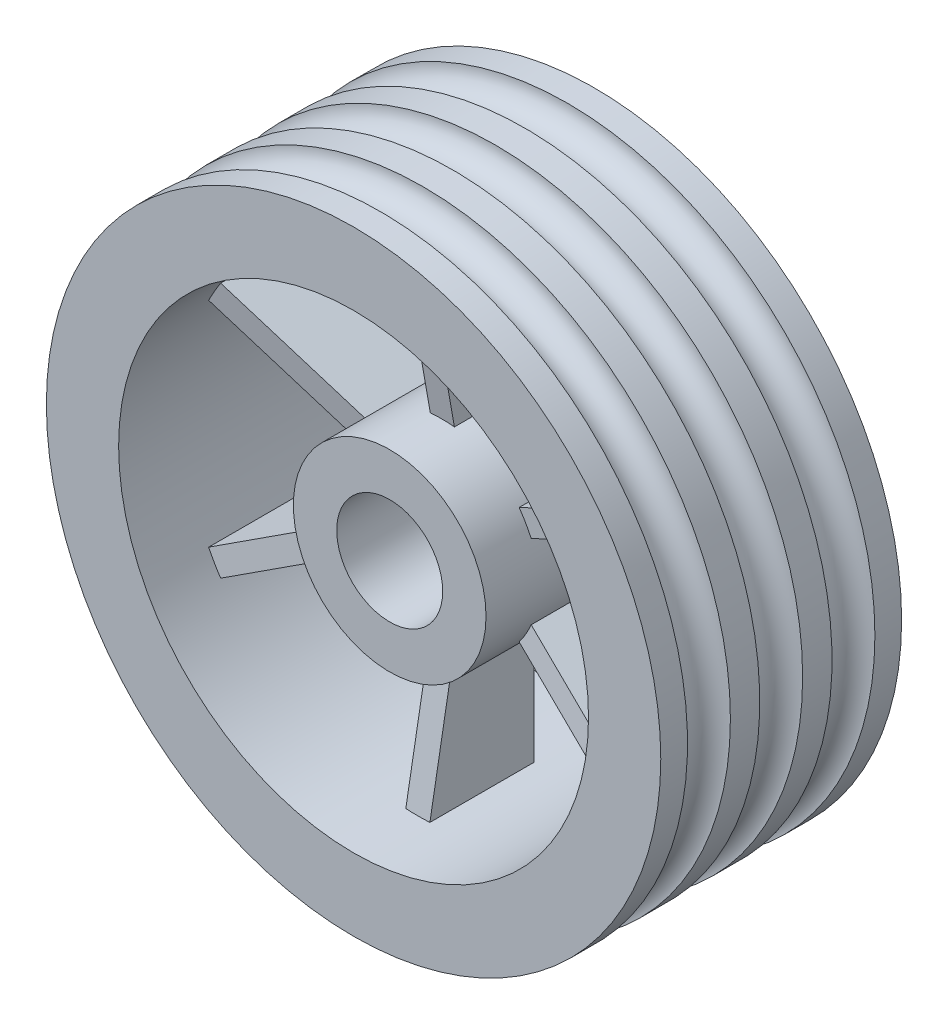
ISO-10303-21;
HEADER;
FILE_DESCRIPTION(('STEP AP214'),'2;1');
FILE_NAME('part.step','',(''),(''),'','','');
FILE_SCHEMA(('AUTOMOTIVE_DESIGN { 1 0 10303 214 1 1 1 1 }'));
ENDSEC;
DATA;
#1=APPLICATION_CONTEXT('core data for automotive mechanical design processes');
#2=APPLICATION_PROTOCOL_DEFINITION('international standard','automotive_design',2000,#1);
#3=PRODUCT_CONTEXT('',#1,'mechanical');
#4=PRODUCT('Part','Part','',(#3));
#5=PRODUCT_RELATED_PRODUCT_CATEGORY('part','',(#4));
#6=PRODUCT_DEFINITION_FORMATION('','',#4);
#7=PRODUCT_DEFINITION_CONTEXT('part definition',#1,'design');
#8=PRODUCT_DEFINITION('design','',#6,#7);
#9=PRODUCT_DEFINITION_SHAPE('','',#8);
#10=(LENGTH_UNIT() NAMED_UNIT(*) SI_UNIT(.MILLI.,.METRE.));
#11=(NAMED_UNIT(*) PLANE_ANGLE_UNIT() SI_UNIT($,.RADIAN.));
#12=(NAMED_UNIT(*) SI_UNIT($,.STERADIAN.) SOLID_ANGLE_UNIT());
#13=UNCERTAINTY_MEASURE_WITH_UNIT(LENGTH_MEASURE(1.E-05),#10,'distance_accuracy_value','');
#14=(GEOMETRIC_REPRESENTATION_CONTEXT(3) GLOBAL_UNCERTAINTY_ASSIGNED_CONTEXT((#13)) GLOBAL_UNIT_ASSIGNED_CONTEXT((#10,
#11,#12)) REPRESENTATION_CONTEXT('',''));
#15=CARTESIAN_POINT('',(0.,0.,0.));
#16=DIRECTION('',(0.,0.,1.));
#17=DIRECTION('',(1.,0.,0.));
#18=AXIS2_PLACEMENT_3D('',#15,#16,#17);
#19=CARTESIAN_POINT('',(0.,0.,10.));
#20=DIRECTION('',(0.,0.,-1.));
#21=DIRECTION('',(-1.,0.,0.));
#22=AXIS2_PLACEMENT_3D('',#19,#20,#21);
#23=CYLINDRICAL_SURFACE('',#22,12.755);
#24=CARTESIAN_POINT('',(0.,0.,1.11));
#25=DIRECTION('',(0.,0.,1.));
#26=DIRECTION('',(1.,0.,0.));
#27=AXIS2_PLACEMENT_3D('',#24,#25,#26);
#28=CIRCLE('',#27,12.755);
#29=CARTESIAN_POINT('',(12.755,0.,1.11));
#30=VERTEX_POINT('',#29);
#31=EDGE_CURVE('E436',#30,#30,#28,.F.);
#32=ORIENTED_EDGE('',*,*,#31,.T.);
#33=EDGE_LOOP('',(#32));
#34=FACE_BOUND('',#33,.T.);
#35=CARTESIAN_POINT('',(0.,0.,0.));
#36=DIRECTION('',(0.,0.,1.));
#37=DIRECTION('',(1.,0.,0.));
#38=AXIS2_PLACEMENT_3D('',#35,#36,#37);
#39=CIRCLE('',#38,12.755);
#40=CARTESIAN_POINT('',(12.755,0.,0.));
#41=VERTEX_POINT('',#40);
#42=EDGE_CURVE('E386',#41,#41,#39,.T.);
#43=ORIENTED_EDGE('',*,*,#42,.T.);
#44=EDGE_LOOP('',(#43));
#45=FACE_BOUND('',#44,.T.);
#46=ADVANCED_FACE('F41',(#34,#45),#23,.T.);
#47=CARTESIAN_POINT('',(0.,0.,10.));
#48=DIRECTION('',(0.,0.,-1.));
#49=DIRECTION('',(-1.,0.,0.));
#50=AXIS2_PLACEMENT_3D('',#47,#48,#49);
#51=CYLINDRICAL_SURFACE('',#50,9.755);
#52=CARTESIAN_POINT('',(0.,0.,10.));
#53=DIRECTION('',(0.,0.,1.));
#54=DIRECTION('',(1.,0.,0.));
#55=AXIS2_PLACEMENT_3D('',#52,#53,#54);
#56=CIRCLE('',#55,9.755);
#57=CARTESIAN_POINT('',(9.755,0.,10.));
#58=VERTEX_POINT('',#57);
#59=EDGE_CURVE('E383',#58,#58,#56,.T.);
#60=ORIENTED_EDGE('',*,*,#59,.T.);
#61=EDGE_LOOP('',(#60));
#62=FACE_BOUND('',#61,.T.);
#63=CARTESIAN_POINT('',(0.,0.,0.));
#64=DIRECTION('',(0.,0.,1.));
#65=DIRECTION('',(1.,0.,0.));
#66=AXIS2_PLACEMENT_3D('',#63,#64,#65);
#67=CIRCLE('',#66,9.755);
#68=CARTESIAN_POINT('',(9.755,0.,0.));
#69=VERTEX_POINT('',#68);
#70=EDGE_CURVE('E382',#69,#69,#67,.T.);
#71=ORIENTED_EDGE('',*,*,#70,.F.);
#72=EDGE_LOOP('',(#71));
#73=FACE_BOUND('',#72,.T.);
#74=CARTESIAN_POINT('',(0.,0.,3.));
#75=DIRECTION('',(0.,0.,-1.));
#76=DIRECTION('',(-1.,0.,0.));
#77=AXIS2_PLACEMENT_3D('',#74,#75,#76);
#78=CIRCLE('',#77,9.755);
#79=CARTESIAN_POINT('',(-0.5,9.74217763131016,3.));
#80=VERTEX_POINT('',#79);
#81=CARTESIAN_POINT('',(0.5,9.74217763131016,3.));
#82=VERTEX_POINT('',#81);
#83=EDGE_CURVE('E397',#80,#82,#78,.T.);
#84=ORIENTED_EDGE('',*,*,#83,.F.);
#85=DIRECTION('',(0.,0.,-1.));
#86=VECTOR('',#85,1.);
#87=CARTESIAN_POINT('',(-0.5,9.74217763131016,10.));
#88=LINE('',#87,#86);
#89=CARTESIAN_POINT('',(-0.5,9.74217763131016,7.33097252317238));
#90=VERTEX_POINT('',#89);
#91=EDGE_CURVE('E403',#80,#90,#88,.F.);
#92=ORIENTED_EDGE('',*,*,#91,.T.);
#93=CARTESIAN_POINT('',(0.,0.,5.61176470588235));
#94=DIRECTION('',(0.,-0.173785333909048,0.984783558817937));
#95=DIRECTION('',(0.,-0.984783558817937,-0.173785333909048));
#96=AXIS2_PLACEMENT_3D('',#93,#94,#95);
#97=ELLIPSE('',#96,9.90572995726005,9.755);
#98=CARTESIAN_POINT('',(0.5,9.74217763131016,7.33097252317238));
#99=VERTEX_POINT('',#98);
#100=EDGE_CURVE('E400',#99,#90,#97,.T.);
#101=ORIENTED_EDGE('',*,*,#100,.F.);
#102=DIRECTION('',(0.,0.,-1.));
#103=VECTOR('',#102,1.);
#104=CARTESIAN_POINT('',(0.5,9.74217763131016,10.));
#105=LINE('',#104,#103);
#106=EDGE_CURVE('E392',#82,#99,#105,.F.);
#107=ORIENTED_EDGE('',*,*,#106,.F.);
#108=EDGE_LOOP('',(#84,#92,#101,#107));
#109=FACE_BOUND('',#108,.T.);
#110=CARTESIAN_POINT('',(0.,0.,3.));
#111=DIRECTION('',(0.,0.,-1.));
#112=DIRECTION('',(-1.,0.,0.));
#113=AXIS2_PLACEMENT_3D('',#110,#111,#112);
#114=CIRCLE('',#113,9.755);
#115=CARTESIAN_POINT('',(8.18697331689512,5.30410151754728,3.));
#116=VERTEX_POINT('',#115);
#117=CARTESIAN_POINT('',(8.68697331689512,4.43807611376284,3.));
#118=VERTEX_POINT('',#117);
#119=EDGE_CURVE('E339',#116,#118,#114,.T.);
#120=ORIENTED_EDGE('',*,*,#119,.F.);
#121=DIRECTION('',(0.,0.,-1.));
#122=VECTOR('',#121,1.);
#123=CARTESIAN_POINT('',(8.18697331689512,5.30410151754728,10.));
#124=LINE('',#123,#122);
#125=CARTESIAN_POINT('',(8.18697331689513,5.30410151754728,7.33097252317238));
#126=VERTEX_POINT('',#125);
#127=EDGE_CURVE('E351',#116,#126,#124,.F.);
#128=ORIENTED_EDGE('',*,*,#127,.T.);
#129=CARTESIAN_POINT('',(0.,0.,5.61176470588235));
#130=DIRECTION('',(-0.150502513970397,-0.0868926669545235,0.984783558817937));
#131=DIRECTION('',(-0.852847579165581,-0.492391779408967,-0.173785333909048));
#132=AXIS2_PLACEMENT_3D('',#129,#130,#131);
#133=ELLIPSE('',#132,9.90572995726005,9.755);
#134=CARTESIAN_POINT('',(8.68697331689512,4.43807611376284,7.33097252317238));
#135=VERTEX_POINT('',#134);
#136=EDGE_CURVE('E345',#135,#126,#133,.T.);
#137=ORIENTED_EDGE('',*,*,#136,.F.);
#138=DIRECTION('',(0.,0.,-1.));
#139=VECTOR('',#138,1.);
#140=CARTESIAN_POINT('',(8.68697331689512,4.43807611376284,10.));
#141=LINE('',#140,#139);
#142=EDGE_CURVE('E348',#118,#135,#141,.F.);
#143=ORIENTED_EDGE('',*,*,#142,.F.);
#144=EDGE_LOOP('',(#120,#128,#137,#143));
#145=FACE_BOUND('',#144,.T.);
#146=CARTESIAN_POINT('',(0.,0.,3.));
#147=DIRECTION('',(0.,0.,-1.));
#148=DIRECTION('',(-1.,0.,0.));
#149=AXIS2_PLACEMENT_3D('',#146,#147,#148);
#150=CIRCLE('',#149,9.755);
#151=CARTESIAN_POINT('',(8.68697331689509,-4.4380761137629,3.));
#152=VERTEX_POINT('',#151);
#153=CARTESIAN_POINT('',(8.18697331689508,-5.30410151754734,3.));
#154=VERTEX_POINT('',#153);
#155=EDGE_CURVE('E310',#152,#154,#150,.T.);
#156=ORIENTED_EDGE('',*,*,#155,.F.);
#157=DIRECTION('',(0.,0.,-1.));
#158=VECTOR('',#157,1.);
#159=CARTESIAN_POINT('',(8.68697331689509,-4.4380761137629,10.));
#160=LINE('',#159,#158);
#161=CARTESIAN_POINT('',(8.68697331689509,-4.4380761137629,7.33097252317238));
#162=VERTEX_POINT('',#161);
#163=EDGE_CURVE('E322',#152,#162,#160,.F.);
#164=ORIENTED_EDGE('',*,*,#163,.T.);
#165=CARTESIAN_POINT('',(0.,0.,5.61176470588235));
#166=DIRECTION('',(-0.150502513970396,0.0868926669545245,0.984783558817937));
#167=DIRECTION('',(-0.852847579165578,0.492391779408972,-0.173785333909048));
#168=AXIS2_PLACEMENT_3D('',#165,#166,#167);
#169=ELLIPSE('',#168,9.90572995726005,9.755);
#170=CARTESIAN_POINT('',(8.18697331689508,-5.30410151754734,7.33097252317238));
#171=VERTEX_POINT('',#170);
#172=EDGE_CURVE('E316',#171,#162,#169,.T.);
#173=ORIENTED_EDGE('',*,*,#172,.F.);
#174=DIRECTION('',(0.,0.,-1.));
#175=VECTOR('',#174,1.);
#176=CARTESIAN_POINT('',(8.18697331689508,-5.30410151754734,10.));
#177=LINE('',#176,#175);
#178=EDGE_CURVE('E319',#154,#171,#177,.F.);
#179=ORIENTED_EDGE('',*,*,#178,.F.);
#180=EDGE_LOOP('',(#156,#164,#173,#179));
#181=FACE_BOUND('',#180,.T.);
#182=CARTESIAN_POINT('',(0.,0.,3.));
#183=DIRECTION('',(0.,0.,-1.));
#184=DIRECTION('',(-1.,0.,0.));
#185=AXIS2_PLACEMENT_3D('',#182,#183,#184);
#186=CIRCLE('',#185,9.755);
#187=CARTESIAN_POINT('',(0.5,-9.74217763131016,3.));
#188=VERTEX_POINT('',#187);
#189=CARTESIAN_POINT('',(-0.5,-9.74217763131016,3.));
#190=VERTEX_POINT('',#189);
#191=EDGE_CURVE('E281',#188,#190,#186,.T.);
#192=ORIENTED_EDGE('',*,*,#191,.F.);
#193=DIRECTION('',(0.,0.,-1.));
#194=VECTOR('',#193,1.);
#195=CARTESIAN_POINT('',(0.5,-9.74217763131016,10.));
#196=LINE('',#195,#194);
#197=CARTESIAN_POINT('',(0.5,-9.74217763131016,7.33097252317238));
#198=VERTEX_POINT('',#197);
#199=EDGE_CURVE('E293',#188,#198,#196,.F.);
#200=ORIENTED_EDGE('',*,*,#199,.T.);
#201=CARTESIAN_POINT('',(0.,0.,5.61176470588235));
#202=DIRECTION('',(0.,0.173785333909048,0.984783558817937));
#203=DIRECTION('',(0.,0.984783558817937,-0.173785333909048));
#204=AXIS2_PLACEMENT_3D('',#201,#202,#203);
#205=ELLIPSE('',#204,9.90572995726005,9.755);
#206=CARTESIAN_POINT('',(-0.5,-9.74217763131016,7.33097252317238));
#207=VERTEX_POINT('',#206);
#208=EDGE_CURVE('E287',#207,#198,#205,.T.);
#209=ORIENTED_EDGE('',*,*,#208,.F.);
#210=DIRECTION('',(0.,0.,-1.));
#211=VECTOR('',#210,1.);
#212=CARTESIAN_POINT('',(-0.5,-9.74217763131016,10.));
#213=LINE('',#212,#211);
#214=EDGE_CURVE('E290',#190,#207,#213,.F.);
#215=ORIENTED_EDGE('',*,*,#214,.F.);
#216=EDGE_LOOP('',(#192,#200,#209,#215));
#217=FACE_BOUND('',#216,.T.);
#218=CARTESIAN_POINT('',(0.,0.,3.));
#219=DIRECTION('',(0.,0.,-1.));
#220=DIRECTION('',(-1.,0.,0.));
#221=AXIS2_PLACEMENT_3D('',#218,#219,#220);
#222=CIRCLE('',#221,9.755);
#223=CARTESIAN_POINT('',(-8.18697331689516,-5.30410151754722,3.));
#224=VERTEX_POINT('',#223);
#225=CARTESIAN_POINT('',(-8.68697331689515,-4.43807611376278,3.));
#226=VERTEX_POINT('',#225);
#227=EDGE_CURVE('E252',#224,#226,#222,.T.);
#228=ORIENTED_EDGE('',*,*,#227,.F.);
#229=DIRECTION('',(0.,0.,-1.));
#230=VECTOR('',#229,1.);
#231=CARTESIAN_POINT('',(-8.18697331689516,-5.30410151754722,10.));
#232=LINE('',#231,#230);
#233=CARTESIAN_POINT('',(-8.18697331689516,-5.30410151754723,7.33097252317238));
#234=VERTEX_POINT('',#233);
#235=EDGE_CURVE('E264',#224,#234,#232,.F.);
#236=ORIENTED_EDGE('',*,*,#235,.T.);
#237=CARTESIAN_POINT('',(0.,0.,5.61176470588235));
#238=DIRECTION('',(0.150502513970397,0.0868926669545224,0.984783558817937));
#239=DIRECTION('',(0.852847579165585,0.492391779408961,-0.173785333909048));
#240=AXIS2_PLACEMENT_3D('',#237,#238,#239);
#241=ELLIPSE('',#240,9.90572995726005,9.755);
#242=CARTESIAN_POINT('',(-8.68697331689515,-4.43807611376278,7.33097252317238));
#243=VERTEX_POINT('',#242);
#244=EDGE_CURVE('E258',#243,#234,#241,.T.);
#245=ORIENTED_EDGE('',*,*,#244,.F.);
#246=DIRECTION('',(0.,0.,-1.));
#247=VECTOR('',#246,1.);
#248=CARTESIAN_POINT('',(-8.68697331689515,-4.43807611376278,10.));
#249=LINE('',#248,#247);
#250=EDGE_CURVE('E261',#226,#243,#249,.F.);
#251=ORIENTED_EDGE('',*,*,#250,.F.);
#252=EDGE_LOOP('',(#228,#236,#245,#251));
#253=FACE_BOUND('',#252,.T.);
#254=CARTESIAN_POINT('',(0.,0.,3.));
#255=DIRECTION('',(0.,0.,-1.));
#256=DIRECTION('',(-1.,0.,0.));
#257=AXIS2_PLACEMENT_3D('',#254,#255,#256);
#258=CIRCLE('',#257,9.755);
#259=CARTESIAN_POINT('',(-8.68697331689506,4.43807611376296,3.));
#260=VERTEX_POINT('',#259);
#261=CARTESIAN_POINT('',(-8.18697331689505,5.30410151754739,3.));
#262=VERTEX_POINT('',#261);
#263=EDGE_CURVE('E63',#260,#262,#258,.T.);
#264=ORIENTED_EDGE('',*,*,#263,.F.);
#265=DIRECTION('',(0.,0.,-1.));
#266=VECTOR('',#265,1.);
#267=CARTESIAN_POINT('',(-8.68697331689506,4.43807611376296,10.));
#268=LINE('',#267,#266);
#269=CARTESIAN_POINT('',(-8.68697331689506,4.43807611376296,7.33097252317238));
#270=VERTEX_POINT('',#269);
#271=EDGE_CURVE('E58',#260,#270,#268,.F.);
#272=ORIENTED_EDGE('',*,*,#271,.T.);
#273=CARTESIAN_POINT('',(0.,0.,5.61176470588235));
#274=DIRECTION('',(0.150502513970395,-0.0868926669545256,0.984783558817937));
#275=DIRECTION('',(0.852847579165575,-0.492391779408978,-0.173785333909048));
#276=AXIS2_PLACEMENT_3D('',#273,#274,#275);
#277=ELLIPSE('',#276,9.90572995726005,9.755);
#278=CARTESIAN_POINT('',(-8.18697331689505,5.30410151754739,7.33097252317238));
#279=VERTEX_POINT('',#278);
#280=EDGE_CURVE('E232',#279,#270,#277,.T.);
#281=ORIENTED_EDGE('',*,*,#280,.F.);
#282=DIRECTION('',(0.,0.,-1.));
#283=VECTOR('',#282,1.);
#284=CARTESIAN_POINT('',(-8.18697331689505,5.30410151754739,10.));
#285=LINE('',#284,#283);
#286=EDGE_CURVE('E234',#262,#279,#285,.F.);
#287=ORIENTED_EDGE('',*,*,#286,.F.);
#288=EDGE_LOOP('',(#264,#272,#281,#287));
#289=FACE_BOUND('',#288,.T.);
#290=ADVANCED_FACE('F462',(#62,#73,#109,#145,#181,#217,#253,#289),#51,.F.);
#291=CARTESIAN_POINT('',(0.,0.,-0.5));
#292=DIRECTION('',(0.,0.,1.));
#293=DIRECTION('',(1.,0.,0.));
#294=AXIS2_PLACEMENT_3D('',#291,#292,#293);
#295=CYLINDRICAL_SURFACE('',#294,4.);
#296=CARTESIAN_POINT('',(0.,0.,8.5));
#297=DIRECTION('',(0.,0.,1.));
#298=DIRECTION('',(1.,0.,0.));
#299=AXIS2_PLACEMENT_3D('',#296,#297,#298);
#300=CIRCLE('',#299,4.);
#301=CARTESIAN_POINT('',(4.,0.,8.5));
#302=VERTEX_POINT('',#301);
#303=EDGE_CURVE('E356',#302,#302,#300,.T.);
#304=ORIENTED_EDGE('',*,*,#303,.F.);
#305=EDGE_LOOP('',(#304));
#306=FACE_BOUND('',#305,.T.);
#307=CARTESIAN_POINT('',(0.,0.,-0.5));
#308=DIRECTION('',(0.,0.,1.));
#309=DIRECTION('',(1.,0.,0.));
#310=AXIS2_PLACEMENT_3D('',#307,#308,#309);
#311=CIRCLE('',#310,4.);
#312=CARTESIAN_POINT('',(4.,0.,-0.5));
#313=VERTEX_POINT('',#312);
#314=EDGE_CURVE('E362',#313,#313,#311,.T.);
#315=ORIENTED_EDGE('',*,*,#314,.T.);
#316=EDGE_LOOP('',(#315));
#317=FACE_BOUND('',#316,.T.);
#318=DIRECTION('',(0.,0.,1.));
#319=VECTOR('',#318,1.);
#320=CARTESIAN_POINT('',(-0.5,3.96862696659689,-0.5));
#321=LINE('',#320,#319);
#322=CARTESIAN_POINT('',(-0.5,3.96862696659689,3.));
#323=VERTEX_POINT('',#322);
#324=CARTESIAN_POINT('',(-0.5,3.96862696659689,6.31211064116416));
#325=VERTEX_POINT('',#324);
#326=EDGE_CURVE('E371',#323,#325,#321,.T.);
#327=ORIENTED_EDGE('',*,*,#326,.F.);
#328=CARTESIAN_POINT('',(0.,0.,3.));
#329=DIRECTION('',(0.,0.,-1.));
#330=DIRECTION('',(-1.,0.,0.));
#331=AXIS2_PLACEMENT_3D('',#328,#329,#330);
#332=CIRCLE('',#331,4.);
#333=CARTESIAN_POINT('',(0.5,3.96862696659689,3.));
#334=VERTEX_POINT('',#333);
#335=EDGE_CURVE('E365',#323,#334,#332,.T.);
#336=ORIENTED_EDGE('',*,*,#335,.T.);
#337=DIRECTION('',(0.,0.,1.));
#338=VECTOR('',#337,1.);
#339=CARTESIAN_POINT('',(0.5,3.96862696659689,-0.5));
#340=LINE('',#339,#338);
#341=CARTESIAN_POINT('',(0.5,3.96862696659689,6.31211064116416));
#342=VERTEX_POINT('',#341);
#343=EDGE_CURVE('E405',#334,#342,#340,.T.);
#344=ORIENTED_EDGE('',*,*,#343,.T.);
#345=CARTESIAN_POINT('',(0.,0.,5.61176470588235));
#346=DIRECTION('',(0.,-0.173785333909048,0.984783558817937));
#347=DIRECTION('',(0.,0.984783558817937,0.173785333909048));
#348=AXIS2_PLACEMENT_3D('',#345,#346,#347);
#349=ELLIPSE('',#348,4.06180623567813,4.);
#350=EDGE_CURVE('E368',#342,#325,#349,.T.);
#351=ORIENTED_EDGE('',*,*,#350,.T.);
#352=EDGE_LOOP('',(#327,#336,#344,#351));
#353=FACE_BOUND('',#352,.T.);
#354=CARTESIAN_POINT('',(0.,0.,5.61176470588235));
#355=DIRECTION('',(-0.150502513970397,-0.0868926669545235,0.984783558817937));
#356=DIRECTION('',(0.852847579165581,0.492391779408967,0.173785333909048));
#357=AXIS2_PLACEMENT_3D('',#354,#355,#356);
#358=ELLIPSE('',#357,4.06180623567813,4.);
#359=CARTESIAN_POINT('',(3.18693177121689,2.41732618519066,6.31211064116416));
#360=VERTEX_POINT('',#359);
#361=CARTESIAN_POINT('',(3.68693177121688,1.55130078140622,6.31211064116416));
#362=VERTEX_POINT('',#361);
#363=EDGE_CURVE('E342',#360,#362,#358,.F.);
#364=ORIENTED_EDGE('',*,*,#363,.F.);
#365=DIRECTION('',(0.,0.,1.));
#366=VECTOR('',#365,1.);
#367=CARTESIAN_POINT('',(3.18693177121689,2.41732618519065,-0.5));
#368=LINE('',#367,#366);
#369=CARTESIAN_POINT('',(3.18693177121689,2.41732618519066,3.));
#370=VERTEX_POINT('',#369);
#371=EDGE_CURVE('E411',#360,#370,#368,.F.);
#372=ORIENTED_EDGE('',*,*,#371,.T.);
#373=CARTESIAN_POINT('',(0.,0.,3.));
#374=DIRECTION('',(0.,0.,-1.));
#375=DIRECTION('',(-1.,0.,0.));
#376=AXIS2_PLACEMENT_3D('',#373,#374,#375);
#377=CIRCLE('',#376,4.);
#378=CARTESIAN_POINT('',(3.68693177121688,1.55130078140621,3.));
#379=VERTEX_POINT('',#378);
#380=EDGE_CURVE('E336',#379,#370,#377,.F.);
#381=ORIENTED_EDGE('',*,*,#380,.F.);
#382=DIRECTION('',(0.,0.,1.));
#383=VECTOR('',#382,1.);
#384=CARTESIAN_POINT('',(3.68693177121688,1.55130078140621,-0.5));
#385=LINE('',#384,#383);
#386=EDGE_CURVE('E408',#362,#379,#385,.F.);
#387=ORIENTED_EDGE('',*,*,#386,.F.);
#388=EDGE_LOOP('',(#364,#372,#381,#387));
#389=FACE_BOUND('',#388,.T.);
#390=CARTESIAN_POINT('',(0.,0.,5.61176470588235));
#391=DIRECTION('',(-0.150502513970396,0.0868926669545245,0.984783558817937));
#392=DIRECTION('',(0.852847579165578,-0.492391779408972,0.173785333909048));
#393=AXIS2_PLACEMENT_3D('',#390,#391,#392);
#394=ELLIPSE('',#393,4.06180623567813,4.);
#395=CARTESIAN_POINT('',(3.68693177121687,-1.55130078140624,6.31211064116416));
#396=VERTEX_POINT('',#395);
#397=CARTESIAN_POINT('',(3.18693177121687,-2.41732618519068,6.31211064116416));
#398=VERTEX_POINT('',#397);
#399=EDGE_CURVE('E313',#396,#398,#394,.F.);
#400=ORIENTED_EDGE('',*,*,#399,.F.);
#401=DIRECTION('',(0.,0.,1.));
#402=VECTOR('',#401,1.);
#403=CARTESIAN_POINT('',(3.68693177121687,-1.55130078140624,-0.5));
#404=LINE('',#403,#402);
#405=CARTESIAN_POINT('',(3.68693177121687,-1.55130078140624,3.));
#406=VERTEX_POINT('',#405);
#407=EDGE_CURVE('E416',#396,#406,#404,.F.);
#408=ORIENTED_EDGE('',*,*,#407,.T.);
#409=CARTESIAN_POINT('',(0.,0.,3.));
#410=DIRECTION('',(0.,0.,-1.));
#411=DIRECTION('',(-1.,0.,0.));
#412=AXIS2_PLACEMENT_3D('',#409,#410,#411);
#413=CIRCLE('',#412,4.);
#414=CARTESIAN_POINT('',(3.18693177121687,-2.41732618519068,3.));
#415=VERTEX_POINT('',#414);
#416=EDGE_CURVE('E307',#415,#406,#413,.F.);
#417=ORIENTED_EDGE('',*,*,#416,.F.);
#418=DIRECTION('',(0.,0.,1.));
#419=VECTOR('',#418,1.);
#420=CARTESIAN_POINT('',(3.18693177121687,-2.41732618519068,-0.5));
#421=LINE('',#420,#419);
#422=EDGE_CURVE('E413',#398,#415,#421,.F.);
#423=ORIENTED_EDGE('',*,*,#422,.F.);
#424=EDGE_LOOP('',(#400,#408,#417,#423));
#425=FACE_BOUND('',#424,.T.);
#426=CARTESIAN_POINT('',(0.,0.,5.61176470588235));
#427=DIRECTION('',(0.,0.173785333909048,0.984783558817937));
#428=DIRECTION('',(0.,-0.984783558817937,0.173785333909048));
#429=AXIS2_PLACEMENT_3D('',#426,#427,#428);
#430=ELLIPSE('',#429,4.06180623567813,4.);
#431=CARTESIAN_POINT('',(0.5,-3.96862696659689,6.31211064116416));
#432=VERTEX_POINT('',#431);
#433=CARTESIAN_POINT('',(-0.5,-3.96862696659689,6.31211064116416));
#434=VERTEX_POINT('',#433);
#435=EDGE_CURVE('E284',#432,#434,#430,.F.);
#436=ORIENTED_EDGE('',*,*,#435,.F.);
#437=DIRECTION('',(0.,0.,1.));
#438=VECTOR('',#437,1.);
#439=CARTESIAN_POINT('',(0.5,-3.96862696659689,-0.5));
#440=LINE('',#439,#438);
#441=CARTESIAN_POINT('',(0.5,-3.96862696659689,3.));
#442=VERTEX_POINT('',#441);
#443=EDGE_CURVE('E421',#432,#442,#440,.F.);
#444=ORIENTED_EDGE('',*,*,#443,.T.);
#445=CARTESIAN_POINT('',(0.,0.,3.));
#446=DIRECTION('',(0.,0.,-1.));
#447=DIRECTION('',(-1.,0.,0.));
#448=AXIS2_PLACEMENT_3D('',#445,#446,#447);
#449=CIRCLE('',#448,4.);
#450=CARTESIAN_POINT('',(-0.5,-3.96862696659689,3.));
#451=VERTEX_POINT('',#450);
#452=EDGE_CURVE('E278',#451,#442,#449,.F.);
#453=ORIENTED_EDGE('',*,*,#452,.F.);
#454=DIRECTION('',(0.,0.,1.));
#455=VECTOR('',#454,1.);
#456=CARTESIAN_POINT('',(-0.5,-3.96862696659689,-0.5));
#457=LINE('',#456,#455);
#458=EDGE_CURVE('E418',#434,#451,#457,.F.);
#459=ORIENTED_EDGE('',*,*,#458,.F.);
#460=EDGE_LOOP('',(#436,#444,#453,#459));
#461=FACE_BOUND('',#460,.T.);
#462=CARTESIAN_POINT('',(0.,0.,5.61176470588235));
#463=DIRECTION('',(0.150502513970397,0.0868926669545224,0.984783558817937));
#464=DIRECTION('',(-0.852847579165585,-0.492391779408961,0.173785333909048));
#465=AXIS2_PLACEMENT_3D('',#462,#463,#464);
#466=ELLIPSE('',#465,4.06180623567813,4.);
#467=CARTESIAN_POINT('',(-3.1869317712169,-2.41732618519063,6.31211064116416));
#468=VERTEX_POINT('',#467);
#469=CARTESIAN_POINT('',(-3.68693177121689,-1.55130078140619,6.31211064116416));
#470=VERTEX_POINT('',#469);
#471=EDGE_CURVE('E255',#468,#470,#466,.F.);
#472=ORIENTED_EDGE('',*,*,#471,.F.);
#473=DIRECTION('',(0.,0.,1.));
#474=VECTOR('',#473,1.);
#475=CARTESIAN_POINT('',(-3.1869317712169,-2.41732618519063,-0.5));
#476=LINE('',#475,#474);
#477=CARTESIAN_POINT('',(-3.1869317712169,-2.41732618519063,3.));
#478=VERTEX_POINT('',#477);
#479=EDGE_CURVE('E219',#468,#478,#476,.F.);
#480=ORIENTED_EDGE('',*,*,#479,.T.);
#481=CARTESIAN_POINT('',(0.,0.,3.));
#482=DIRECTION('',(0.,0.,-1.));
#483=DIRECTION('',(-1.,0.,0.));
#484=AXIS2_PLACEMENT_3D('',#481,#482,#483);
#485=CIRCLE('',#484,4.);
#486=CARTESIAN_POINT('',(-3.68693177121689,-1.55130078140619,3.));
#487=VERTEX_POINT('',#486);
#488=EDGE_CURVE('E249',#487,#478,#485,.F.);
#489=ORIENTED_EDGE('',*,*,#488,.F.);
#490=DIRECTION('',(0.,0.,1.));
#491=VECTOR('',#490,1.);
#492=CARTESIAN_POINT('',(-3.68693177121689,-1.55130078140619,-0.5));
#493=LINE('',#492,#491);
#494=EDGE_CURVE('E423',#470,#487,#493,.F.);
#495=ORIENTED_EDGE('',*,*,#494,.F.);
#496=EDGE_LOOP('',(#472,#480,#489,#495));
#497=FACE_BOUND('',#496,.T.);
#498=CARTESIAN_POINT('',(0.,0.,5.61176470588235));
#499=DIRECTION('',(0.150502513970395,-0.0868926669545256,0.984783558817937));
#500=DIRECTION('',(-0.852847579165575,0.492391779408978,0.173785333909048));
#501=AXIS2_PLACEMENT_3D('',#498,#499,#500);
#502=ELLIPSE('',#501,4.06180623567813,4.);
#503=CARTESIAN_POINT('',(-3.68693177121686,1.55130078140627,6.31211064116416));
#504=VERTEX_POINT('',#503);
#505=CARTESIAN_POINT('',(-3.18693177121685,2.4173261851907,6.31211064116416));
#506=VERTEX_POINT('',#505);
#507=EDGE_CURVE('E230',#504,#506,#502,.F.);
#508=ORIENTED_EDGE('',*,*,#507,.F.);
#509=DIRECTION('',(0.,0.,1.));
#510=VECTOR('',#509,1.);
#511=CARTESIAN_POINT('',(-3.68693177121686,1.55130078140627,-0.5));
#512=LINE('',#511,#510);
#513=CARTESIAN_POINT('',(-3.68693177121686,1.55130078140627,3.));
#514=VERTEX_POINT('',#513);
#515=EDGE_CURVE('E11',#504,#514,#512,.F.);
#516=ORIENTED_EDGE('',*,*,#515,.T.);
#517=CARTESIAN_POINT('',(0.,0.,3.));
#518=DIRECTION('',(0.,0.,-1.));
#519=DIRECTION('',(-1.,0.,0.));
#520=AXIS2_PLACEMENT_3D('',#517,#518,#519);
#521=CIRCLE('',#520,4.);
#522=CARTESIAN_POINT('',(-3.18693177121685,2.4173261851907,3.));
#523=VERTEX_POINT('',#522);
#524=EDGE_CURVE('E200',#523,#514,#521,.F.);
#525=ORIENTED_EDGE('',*,*,#524,.F.);
#526=DIRECTION('',(0.,0.,1.));
#527=VECTOR('',#526,1.);
#528=CARTESIAN_POINT('',(-3.18693177121685,2.4173261851907,-0.5));
#529=LINE('',#528,#527);
#530=EDGE_CURVE('E50',#506,#523,#529,.F.);
#531=ORIENTED_EDGE('',*,*,#530,.F.);
#532=EDGE_LOOP('',(#508,#516,#525,#531));
#533=FACE_BOUND('',#532,.T.);
#534=ADVANCED_FACE('F202',(#306,#317,#353,#389,#425,#461,#497,#533),#295,.T.);
#535=CARTESIAN_POINT('',(0.,0.,10.));
#536=DIRECTION('',(0.,0.,1.));
#537=DIRECTION('',(1.,0.,0.));
#538=AXIS2_PLACEMENT_3D('',#535,#536,#537);
#539=PLANE('',#538);
#540=CARTESIAN_POINT('',(0.,0.,10.));
#541=DIRECTION('',(0.,0.,1.));
#542=DIRECTION('',(1.,0.,0.));
#543=AXIS2_PLACEMENT_3D('',#540,#541,#542);
#544=CIRCLE('',#543,12.755);
#545=CARTESIAN_POINT('',(12.755,0.,10.));
#546=VERTEX_POINT('',#545);
#547=EDGE_CURVE('E389',#546,#546,#544,.T.);
#548=ORIENTED_EDGE('',*,*,#547,.T.);
#549=EDGE_LOOP('',(#548));
#550=FACE_BOUND('',#549,.T.);
#551=ORIENTED_EDGE('',*,*,#59,.F.);
#552=EDGE_LOOP('',(#551));
#553=FACE_BOUND('',#552,.T.);
#554=ADVANCED_FACE('F488',(#550,#553),#539,.T.);
#555=CARTESIAN_POINT('',(0.,0.,0.));
#556=DIRECTION('',(0.,0.,1.));
#557=DIRECTION('',(1.,0.,0.));
#558=AXIS2_PLACEMENT_3D('',#555,#556,#557);
#559=PLANE('',#558);
#560=ORIENTED_EDGE('',*,*,#42,.F.);
#561=EDGE_LOOP('',(#560));
#562=FACE_BOUND('',#561,.T.);
#563=ORIENTED_EDGE('',*,*,#70,.T.);
#564=EDGE_LOOP('',(#563));
#565=FACE_BOUND('',#564,.T.);
#566=ADVANCED_FACE('F480',(#562,#565),#559,.F.);
#567=CARTESIAN_POINT('',(0.,0.,8.89));
#568=DIRECTION('',(0.,0.,-1.));
#569=DIRECTION('',(-1.,0.,0.));
#570=AXIS2_PLACEMENT_3D('',#567,#568,#569);
#571=CIRCLE('',#570,12.755);
#572=CARTESIAN_POINT('',(-12.755,0.,8.89));
#573=VERTEX_POINT('',#572);
#574=EDGE_CURVE('E438',#573,#573,#571,.F.);
#575=ORIENTED_EDGE('',*,*,#574,.T.);
#576=EDGE_LOOP('',(#575));
#577=FACE_BOUND('',#576,.T.);
#578=ORIENTED_EDGE('',*,*,#547,.F.);
#579=EDGE_LOOP('',(#578));
#580=FACE_BOUND('',#579,.T.);
#581=ADVANCED_FACE('F43',(#577,#580),#23,.T.);
#582=CARTESIAN_POINT('',(-0.5,10.7,7.5));
#583=DIRECTION('',(0.,-0.173785333909048,0.984783558817937));
#584=DIRECTION('',(0.,-0.984783558817937,-0.173785333909048));
#585=AXIS2_PLACEMENT_3D('',#582,#583,#584);
#586=PLANE('',#585);
#587=ORIENTED_EDGE('',*,*,#350,.F.);
#588=DIRECTION('',(0.,-0.984783558817937,-0.173785333909048));
#589=VECTOR('',#588,1.);
#590=CARTESIAN_POINT('',(0.5,10.7,7.5));
#591=LINE('',#590,#589);
#592=EDGE_CURVE('E373',#99,#342,#591,.T.);
#593=ORIENTED_EDGE('',*,*,#592,.F.);
#594=ORIENTED_EDGE('',*,*,#100,.T.);
#595=DIRECTION('',(0.,-0.984783558817937,-0.173785333909048));
#596=VECTOR('',#595,1.);
#597=CARTESIAN_POINT('',(-0.5,10.7,7.5));
#598=LINE('',#597,#596);
#599=EDGE_CURVE('E377',#90,#325,#598,.T.);
#600=ORIENTED_EDGE('',*,*,#599,.T.);
#601=EDGE_LOOP('',(#587,#593,#594,#600));
#602=FACE_BOUND('',#601,.T.);
#603=ADVANCED_FACE('F479',(#602),#586,.T.);
#604=CARTESIAN_POINT('',(-0.5,2.2,3.));
#605=DIRECTION('',(0.,0.,-1.));
#606=DIRECTION('',(-1.,0.,0.));
#607=AXIS2_PLACEMENT_3D('',#604,#605,#606);
#608=PLANE('',#607);
#609=ORIENTED_EDGE('',*,*,#335,.F.);
#610=DIRECTION('',(0.,1.,0.));
#611=VECTOR('',#610,1.);
#612=CARTESIAN_POINT('',(-0.5,2.2,3.));
#613=LINE('',#612,#611);
#614=EDGE_CURVE('E380',#323,#80,#613,.T.);
#615=ORIENTED_EDGE('',*,*,#614,.T.);
#616=ORIENTED_EDGE('',*,*,#83,.T.);
#617=DIRECTION('',(0.,1.,0.));
#618=VECTOR('',#617,1.);
#619=CARTESIAN_POINT('',(0.5,2.2,3.));
#620=LINE('',#619,#618);
#621=EDGE_CURVE('E375',#334,#82,#620,.T.);
#622=ORIENTED_EDGE('',*,*,#621,.F.);
#623=EDGE_LOOP('',(#609,#615,#616,#622));
#624=FACE_BOUND('',#623,.T.);
#625=ADVANCED_FACE('F485',(#624),#608,.T.);
#626=CARTESIAN_POINT('',(-0.5,0.,0.));
#627=DIRECTION('',(1.,0.,0.));
#628=DIRECTION('',(0.,0.,-1.));
#629=AXIS2_PLACEMENT_3D('',#626,#627,#628);
#630=PLANE('',#629);
#631=ORIENTED_EDGE('',*,*,#614,.F.);
#632=ORIENTED_EDGE('',*,*,#326,.T.);
#633=ORIENTED_EDGE('',*,*,#599,.F.);
#634=ORIENTED_EDGE('',*,*,#91,.F.);
#635=EDGE_LOOP('',(#631,#632,#633,#634));
#636=FACE_BOUND('',#635,.T.);
#637=ADVANCED_FACE('F599',(#636),#630,.F.);
#638=CARTESIAN_POINT('',(0.5,0.,0.));
#639=DIRECTION('',(1.,0.,0.));
#640=DIRECTION('',(0.,0.,-1.));
#641=AXIS2_PLACEMENT_3D('',#638,#639,#640);
#642=PLANE('',#641);
#643=ORIENTED_EDGE('',*,*,#343,.F.);
#644=ORIENTED_EDGE('',*,*,#621,.T.);
#645=ORIENTED_EDGE('',*,*,#106,.T.);
#646=ORIENTED_EDGE('',*,*,#592,.T.);
#647=EDGE_LOOP('',(#643,#644,#645,#646));
#648=FACE_BOUND('',#647,.T.);
#649=ADVANCED_FACE('F592',(#648),#642,.T.);
#650=CARTESIAN_POINT('',(0.,0.,-0.5));
#651=DIRECTION('',(0.,0.,1.));
#652=DIRECTION('',(1.,0.,0.));
#653=AXIS2_PLACEMENT_3D('',#650,#651,#652);
#654=PLANE('',#653);
#655=CARTESIAN_POINT('',(0.,0.,-0.5));
#656=DIRECTION('',(0.,0.,1.));
#657=DIRECTION('',(1.,0.,0.));
#658=AXIS2_PLACEMENT_3D('',#655,#656,#657);
#659=CIRCLE('',#658,2.2);
#660=CARTESIAN_POINT('',(2.2,0.,-0.5));
#661=VERTEX_POINT('',#660);
#662=EDGE_CURVE('E359',#661,#661,#659,.T.);
#663=ORIENTED_EDGE('',*,*,#662,.T.);
#664=EDGE_LOOP('',(#663));
#665=FACE_BOUND('',#664,.T.);
#666=ORIENTED_EDGE('',*,*,#314,.F.);
#667=EDGE_LOOP('',(#666));
#668=FACE_BOUND('',#667,.T.);
#669=ADVANCED_FACE('F588',(#665,#668),#654,.F.);
#670=CARTESIAN_POINT('',(0.,0.,-0.5));
#671=DIRECTION('',(0.,0.,1.));
#672=DIRECTION('',(1.,0.,0.));
#673=AXIS2_PLACEMENT_3D('',#670,#671,#672);
#674=CYLINDRICAL_SURFACE('',#673,2.2);
#675=ORIENTED_EDGE('',*,*,#662,.F.);
#676=EDGE_LOOP('',(#675));
#677=FACE_BOUND('',#676,.T.);
#678=CARTESIAN_POINT('',(0.,0.,8.5));
#679=DIRECTION('',(0.,0.,1.));
#680=DIRECTION('',(1.,0.,0.));
#681=AXIS2_PLACEMENT_3D('',#678,#679,#680);
#682=CIRCLE('',#681,2.2);
#683=CARTESIAN_POINT('',(2.2,0.,8.5));
#684=VERTEX_POINT('',#683);
#685=EDGE_CURVE('E353',#684,#684,#682,.T.);
#686=ORIENTED_EDGE('',*,*,#685,.T.);
#687=EDGE_LOOP('',(#686));
#688=FACE_BOUND('',#687,.T.);
#689=ADVANCED_FACE('F584',(#677,#688),#674,.F.);
#690=CARTESIAN_POINT('',(0.,0.,8.5));
#691=DIRECTION('',(0.,0.,1.));
#692=DIRECTION('',(1.,0.,0.));
#693=AXIS2_PLACEMENT_3D('',#690,#691,#692);
#694=PLANE('',#693);
#695=ORIENTED_EDGE('',*,*,#303,.T.);
#696=EDGE_LOOP('',(#695));
#697=FACE_BOUND('',#696,.T.);
#698=ORIENTED_EDGE('',*,*,#685,.F.);
#699=EDGE_LOOP('',(#698));
#700=FACE_BOUND('',#699,.T.);
#701=ADVANCED_FACE('F580',(#697,#700),#694,.T.);
#702=CARTESIAN_POINT('',(9.01647182049351,5.7830127018922,7.5));
#703=DIRECTION('',(-0.150502513970397,-0.0868926669545235,0.984783558817937));
#704=DIRECTION('',(0.988522467870287,0.,0.151073924009533));
#705=AXIS2_PLACEMENT_3D('',#702,#703,#704);
#706=PLANE('',#705);
#707=DIRECTION('',(-0.852847579165581,-0.492391779408966,-0.173785333909048));
#708=VECTOR('',#707,1.);
#709=CARTESIAN_POINT('',(9.51647182049351,4.91698729810776,7.5));
#710=LINE('',#709,#708);
#711=EDGE_CURVE('E324',#135,#362,#710,.T.);
#712=ORIENTED_EDGE('',*,*,#711,.F.);
#713=ORIENTED_EDGE('',*,*,#136,.T.);
#714=DIRECTION('',(-0.852847579165581,-0.492391779408966,-0.173785333909048));
#715=VECTOR('',#714,1.);
#716=CARTESIAN_POINT('',(9.01647182049351,5.7830127018922,7.5));
#717=LINE('',#716,#715);
#718=EDGE_CURVE('E330',#126,#360,#717,.T.);
#719=ORIENTED_EDGE('',*,*,#718,.T.);
#720=ORIENTED_EDGE('',*,*,#363,.T.);
#721=EDGE_LOOP('',(#712,#713,#719,#720));
#722=FACE_BOUND('',#721,.T.);
#723=ADVANCED_FACE('F576',(#722),#706,.T.);
#724=CARTESIAN_POINT('',(1.65525588832577,1.53301270189222,3.));
#725=DIRECTION('',(0.,0.,-1.));
#726=DIRECTION('',(-1.,0.,0.));
#727=AXIS2_PLACEMENT_3D('',#724,#725,#726);
#728=PLANE('',#727);
#729=DIRECTION('',(0.86602540378444,0.499999999999998,0.));
#730=VECTOR('',#729,1.);
#731=CARTESIAN_POINT('',(1.65525588832577,1.53301270189222,3.));
#732=LINE('',#731,#730);
#733=EDGE_CURVE('E333',#370,#116,#732,.T.);
#734=ORIENTED_EDGE('',*,*,#733,.T.);
#735=ORIENTED_EDGE('',*,*,#119,.T.);
#736=DIRECTION('',(0.86602540378444,0.499999999999998,0.));
#737=VECTOR('',#736,1.);
#738=CARTESIAN_POINT('',(2.15525588832577,0.666987298107776,3.));
#739=LINE('',#738,#737);
#740=EDGE_CURVE('E327',#379,#118,#739,.T.);
#741=ORIENTED_EDGE('',*,*,#740,.F.);
#742=ORIENTED_EDGE('',*,*,#380,.T.);
#743=EDGE_LOOP('',(#734,#735,#741,#742));
#744=FACE_BOUND('',#743,.T.);
#745=ADVANCED_FACE('F572',(#744),#728,.T.);
#746=CARTESIAN_POINT('',(-0.249999999999999,0.43301270189222,0.));
#747=DIRECTION('',(0.499999999999998,-0.86602540378444,0.));
#748=DIRECTION('',(0.,0.,-1.));
#749=AXIS2_PLACEMENT_3D('',#746,#747,#748);
#750=PLANE('',#749);
#751=ORIENTED_EDGE('',*,*,#127,.F.);
#752=ORIENTED_EDGE('',*,*,#733,.F.);
#753=ORIENTED_EDGE('',*,*,#371,.F.);
#754=ORIENTED_EDGE('',*,*,#718,.F.);
#755=EDGE_LOOP('',(#751,#752,#753,#754));
#756=FACE_BOUND('',#755,.T.);
#757=ADVANCED_FACE('F568',(#756),#750,.F.);
#758=CARTESIAN_POINT('',(0.249999999999999,-0.43301270189222,0.));
#759=DIRECTION('',(0.499999999999998,-0.86602540378444,0.));
#760=DIRECTION('',(0.,0.,-1.));
#761=AXIS2_PLACEMENT_3D('',#758,#759,#760);
#762=PLANE('',#761);
#763=ORIENTED_EDGE('',*,*,#740,.T.);
#764=ORIENTED_EDGE('',*,*,#142,.T.);
#765=ORIENTED_EDGE('',*,*,#711,.T.);
#766=ORIENTED_EDGE('',*,*,#386,.T.);
#767=EDGE_LOOP('',(#763,#764,#765,#766));
#768=FACE_BOUND('',#767,.T.);
#769=ADVANCED_FACE('F564',(#768),#762,.T.);
#770=CARTESIAN_POINT('',(9.51647182049348,-4.91698729810783,7.5));
#771=DIRECTION('',(-0.150502513970396,0.0868926669545245,0.984783558817937));
#772=DIRECTION('',(0.988522467870287,0.,0.151073924009533));
#773=AXIS2_PLACEMENT_3D('',#770,#771,#772);
#774=PLANE('',#773);
#775=DIRECTION('',(-0.852847579165578,0.492391779408972,-0.173785333909048));
#776=VECTOR('',#775,1.);
#777=CARTESIAN_POINT('',(9.01647182049347,-5.78301270189226,7.5));
#778=LINE('',#777,#776);
#779=EDGE_CURVE('E295',#171,#398,#778,.T.);
#780=ORIENTED_EDGE('',*,*,#779,.F.);
#781=ORIENTED_EDGE('',*,*,#172,.T.);
#782=DIRECTION('',(-0.852847579165578,0.492391779408972,-0.173785333909048));
#783=VECTOR('',#782,1.);
#784=CARTESIAN_POINT('',(9.51647182049348,-4.91698729810783,7.5));
#785=LINE('',#784,#783);
#786=EDGE_CURVE('E301',#162,#396,#785,.T.);
#787=ORIENTED_EDGE('',*,*,#786,.T.);
#788=ORIENTED_EDGE('',*,*,#399,.T.);
#789=EDGE_LOOP('',(#780,#781,#787,#788));
#790=FACE_BOUND('',#789,.T.);
#791=ADVANCED_FACE('F560',(#790),#774,.T.);
#792=CARTESIAN_POINT('',(2.15525588832576,-0.666987298107791,3.));
#793=DIRECTION('',(0.,0.,-1.));
#794=DIRECTION('',(-1.,0.,0.));
#795=AXIS2_PLACEMENT_3D('',#792,#793,#794);
#796=PLANE('',#795);
#797=DIRECTION('',(0.866025403784436,-0.500000000000004,0.));
#798=VECTOR('',#797,1.);
#799=CARTESIAN_POINT('',(2.15525588832576,-0.666987298107791,3.));
#800=LINE('',#799,#798);
#801=EDGE_CURVE('E304',#406,#152,#800,.T.);
#802=ORIENTED_EDGE('',*,*,#801,.T.);
#803=ORIENTED_EDGE('',*,*,#155,.T.);
#804=DIRECTION('',(0.866025403784436,-0.500000000000004,0.));
#805=VECTOR('',#804,1.);
#806=CARTESIAN_POINT('',(1.65525588832576,-1.53301270189223,3.));
#807=LINE('',#806,#805);
#808=EDGE_CURVE('E298',#415,#154,#807,.T.);
#809=ORIENTED_EDGE('',*,*,#808,.F.);
#810=ORIENTED_EDGE('',*,*,#416,.T.);
#811=EDGE_LOOP('',(#802,#803,#809,#810));
#812=FACE_BOUND('',#811,.T.);
#813=ADVANCED_FACE('F556',(#812),#796,.T.);
#814=CARTESIAN_POINT('',(0.250000000000002,0.433012701892218,0.));
#815=DIRECTION('',(-0.500000000000004,-0.866025403784436,0.));
#816=DIRECTION('',(0.,0.,-1.));
#817=AXIS2_PLACEMENT_3D('',#814,#815,#816);
#818=PLANE('',#817);
#819=ORIENTED_EDGE('',*,*,#163,.F.);
#820=ORIENTED_EDGE('',*,*,#801,.F.);
#821=ORIENTED_EDGE('',*,*,#407,.F.);
#822=ORIENTED_EDGE('',*,*,#786,.F.);
#823=EDGE_LOOP('',(#819,#820,#821,#822));
#824=FACE_BOUND('',#823,.T.);
#825=ADVANCED_FACE('F552',(#824),#818,.F.);
#826=CARTESIAN_POINT('',(-0.250000000000002,-0.433012701892218,0.));
#827=DIRECTION('',(-0.500000000000004,-0.866025403784436,0.));
#828=DIRECTION('',(0.,0.,-1.));
#829=AXIS2_PLACEMENT_3D('',#826,#827,#828);
#830=PLANE('',#829);
#831=ORIENTED_EDGE('',*,*,#808,.T.);
#832=ORIENTED_EDGE('',*,*,#178,.T.);
#833=ORIENTED_EDGE('',*,*,#779,.T.);
#834=ORIENTED_EDGE('',*,*,#422,.T.);
#835=EDGE_LOOP('',(#831,#832,#833,#834));
#836=FACE_BOUND('',#835,.T.);
#837=ADVANCED_FACE('F548',(#836),#830,.T.);
#838=CARTESIAN_POINT('',(0.5,-10.7,7.5));
#839=DIRECTION('',(0.,0.173785333909048,0.984783558817937));
#840=DIRECTION('',(0.,-0.984783558817937,0.173785333909048));
#841=AXIS2_PLACEMENT_3D('',#838,#839,#840);
#842=PLANE('',#841);
#843=DIRECTION('',(0.,0.984783558817937,-0.173785333909048));
#844=VECTOR('',#843,1.);
#845=CARTESIAN_POINT('',(-0.5,-10.7,7.5));
#846=LINE('',#845,#844);
#847=EDGE_CURVE('E266',#207,#434,#846,.T.);
#848=ORIENTED_EDGE('',*,*,#847,.F.);
#849=ORIENTED_EDGE('',*,*,#208,.T.);
#850=DIRECTION('',(0.,0.984783558817937,-0.173785333909048));
#851=VECTOR('',#850,1.);
#852=CARTESIAN_POINT('',(0.5,-10.7,7.5));
#853=LINE('',#852,#851);
#854=EDGE_CURVE('E272',#198,#432,#853,.T.);
#855=ORIENTED_EDGE('',*,*,#854,.T.);
#856=ORIENTED_EDGE('',*,*,#435,.T.);
#857=EDGE_LOOP('',(#848,#849,#855,#856));
#858=FACE_BOUND('',#857,.T.);
#859=ADVANCED_FACE('F544',(#858),#842,.T.);
#860=CARTESIAN_POINT('',(0.5,-2.2,3.));
#861=DIRECTION('',(0.,0.,-1.));
#862=DIRECTION('',(-1.,0.,0.));
#863=AXIS2_PLACEMENT_3D('',#860,#861,#862);
#864=PLANE('',#863);
#865=DIRECTION('',(0.,-1.,0.));
#866=VECTOR('',#865,1.);
#867=CARTESIAN_POINT('',(0.5,-2.2,3.));
#868=LINE('',#867,#866);
#869=EDGE_CURVE('E275',#442,#188,#868,.T.);
#870=ORIENTED_EDGE('',*,*,#869,.T.);
#871=ORIENTED_EDGE('',*,*,#191,.T.);
#872=DIRECTION('',(0.,-1.,0.));
#873=VECTOR('',#872,1.);
#874=CARTESIAN_POINT('',(-0.5,-2.2,3.));
#875=LINE('',#874,#873);
#876=EDGE_CURVE('E269',#451,#190,#875,.T.);
#877=ORIENTED_EDGE('',*,*,#876,.F.);
#878=ORIENTED_EDGE('',*,*,#452,.T.);
#879=EDGE_LOOP('',(#870,#871,#877,#878));
#880=FACE_BOUND('',#879,.T.);
#881=ADVANCED_FACE('F540',(#880),#864,.T.);
#882=CARTESIAN_POINT('',(0.5,0.,0.));
#883=DIRECTION('',(-1.,0.,0.));
#884=DIRECTION('',(0.,0.,-1.));
#885=AXIS2_PLACEMENT_3D('',#882,#883,#884);
#886=PLANE('',#885);
#887=ORIENTED_EDGE('',*,*,#199,.F.);
#888=ORIENTED_EDGE('',*,*,#869,.F.);
#889=ORIENTED_EDGE('',*,*,#443,.F.);
#890=ORIENTED_EDGE('',*,*,#854,.F.);
#891=EDGE_LOOP('',(#887,#888,#889,#890));
#892=FACE_BOUND('',#891,.T.);
#893=ADVANCED_FACE('F533',(#892),#886,.F.);
#894=CARTESIAN_POINT('',(-0.5,0.,0.));
#895=DIRECTION('',(-1.,0.,0.));
#896=DIRECTION('',(0.,0.,-1.));
#897=AXIS2_PLACEMENT_3D('',#894,#895,#896);
#898=PLANE('',#897);
#899=ORIENTED_EDGE('',*,*,#876,.T.);
#900=ORIENTED_EDGE('',*,*,#214,.T.);
#901=ORIENTED_EDGE('',*,*,#847,.T.);
#902=ORIENTED_EDGE('',*,*,#458,.T.);
#903=EDGE_LOOP('',(#899,#900,#901,#902));
#904=FACE_BOUND('',#903,.T.);
#905=ADVANCED_FACE('F526',(#904),#898,.T.);
#906=CARTESIAN_POINT('',(-9.01647182049355,-5.78301270189214,7.5));
#907=DIRECTION('',(0.150502513970397,0.0868926669545224,0.984783558817937));
#908=DIRECTION('',(0.988522467870287,0.,-0.151073924009534));
#909=AXIS2_PLACEMENT_3D('',#906,#907,#908);
#910=PLANE('',#909);
#911=DIRECTION('',(0.852847579165585,0.49239177940896,-0.173785333909048));
#912=VECTOR('',#911,1.);
#913=CARTESIAN_POINT('',(-9.51647182049354,-4.91698729810769,7.5));
#914=LINE('',#913,#912);
#915=EDGE_CURVE('E237',#243,#470,#914,.T.);
#916=ORIENTED_EDGE('',*,*,#915,.F.);
#917=ORIENTED_EDGE('',*,*,#244,.T.);
#918=DIRECTION('',(0.852847579165585,0.49239177940896,-0.173785333909048));
#919=VECTOR('',#918,1.);
#920=CARTESIAN_POINT('',(-9.01647182049355,-5.78301270189214,7.5));
#921=LINE('',#920,#919);
#922=EDGE_CURVE('E243',#234,#468,#921,.T.);
#923=ORIENTED_EDGE('',*,*,#922,.T.);
#924=ORIENTED_EDGE('',*,*,#471,.T.);
#925=EDGE_LOOP('',(#916,#917,#923,#924));
#926=FACE_BOUND('',#925,.T.);
#927=ADVANCED_FACE('F524',(#926),#910,.T.);
#928=CARTESIAN_POINT('',(-1.65525588832578,-1.5330127018922,3.));
#929=DIRECTION('',(0.,0.,-1.));
#930=DIRECTION('',(-1.,0.,0.));
#931=AXIS2_PLACEMENT_3D('',#928,#929,#930);
#932=PLANE('',#931);
#933=DIRECTION('',(-0.866025403784443,-0.499999999999992,0.));
#934=VECTOR('',#933,1.);
#935=CARTESIAN_POINT('',(-1.65525588832578,-1.5330127018922,3.));
#936=LINE('',#935,#934);
#937=EDGE_CURVE('E246',#478,#224,#936,.T.);
#938=ORIENTED_EDGE('',*,*,#937,.T.);
#939=ORIENTED_EDGE('',*,*,#227,.T.);
#940=DIRECTION('',(-0.866025403784443,-0.499999999999992,0.));
#941=VECTOR('',#940,1.);
#942=CARTESIAN_POINT('',(-2.15525588832577,-0.666987298107761,3.));
#943=LINE('',#942,#941);
#944=EDGE_CURVE('E240',#487,#226,#943,.T.);
#945=ORIENTED_EDGE('',*,*,#944,.F.);
#946=ORIENTED_EDGE('',*,*,#488,.T.);
#947=EDGE_LOOP('',(#938,#939,#945,#946));
#948=FACE_BOUND('',#947,.T.);
#949=ADVANCED_FACE('F518',(#948),#932,.T.);
#950=CARTESIAN_POINT('',(0.249999999999996,-0.433012701892222,0.));
#951=DIRECTION('',(-0.499999999999992,0.866025403784443,0.));
#952=DIRECTION('',(0.,0.,-1.));
#953=AXIS2_PLACEMENT_3D('',#950,#951,#952);
#954=PLANE('',#953);
#955=ORIENTED_EDGE('',*,*,#235,.F.);
#956=ORIENTED_EDGE('',*,*,#937,.F.);
#957=ORIENTED_EDGE('',*,*,#479,.F.);
#958=ORIENTED_EDGE('',*,*,#922,.F.);
#959=EDGE_LOOP('',(#955,#956,#957,#958));
#960=FACE_BOUND('',#959,.T.);
#961=ADVANCED_FACE('F516',(#960),#954,.F.);
#962=CARTESIAN_POINT('',(-0.249999999999996,0.433012701892222,0.));
#963=DIRECTION('',(-0.499999999999992,0.866025403784443,0.));
#964=DIRECTION('',(0.,0.,-1.));
#965=AXIS2_PLACEMENT_3D('',#962,#963,#964);
#966=PLANE('',#965);
#967=ORIENTED_EDGE('',*,*,#944,.T.);
#968=ORIENTED_EDGE('',*,*,#250,.T.);
#969=ORIENTED_EDGE('',*,*,#915,.T.);
#970=ORIENTED_EDGE('',*,*,#494,.T.);
#971=EDGE_LOOP('',(#967,#968,#969,#970));
#972=FACE_BOUND('',#971,.T.);
#973=ADVANCED_FACE('F521',(#972),#966,.T.);
#974=CARTESIAN_POINT('',(-9.51647182049344,4.91698729810789,7.5));
#975=DIRECTION('',(0.150502513970395,-0.0868926669545256,0.984783558817937));
#976=DIRECTION('',(0.988522467870287,0.,-0.151073924009532));
#977=AXIS2_PLACEMENT_3D('',#974,#975,#976);
#978=PLANE('',#977);
#979=DIRECTION('',(0.852847579165574,-0.492391779408978,-0.173785333909048));
#980=VECTOR('',#979,1.);
#981=CARTESIAN_POINT('',(-9.01647182049343,5.78301270189233,7.5));
#982=LINE('',#981,#980);
#983=EDGE_CURVE('E218',#279,#506,#982,.T.);
#984=ORIENTED_EDGE('',*,*,#983,.F.);
#985=ORIENTED_EDGE('',*,*,#280,.T.);
#986=DIRECTION('',(0.852847579165574,-0.492391779408978,-0.173785333909048));
#987=VECTOR('',#986,1.);
#988=CARTESIAN_POINT('',(-9.51647182049344,4.91698729810789,7.5));
#989=LINE('',#988,#987);
#990=EDGE_CURVE('E222',#270,#504,#989,.T.);
#991=ORIENTED_EDGE('',*,*,#990,.T.);
#992=ORIENTED_EDGE('',*,*,#507,.T.);
#993=EDGE_LOOP('',(#984,#985,#991,#992));
#994=FACE_BOUND('',#993,.T.);
#995=ADVANCED_FACE('F707',(#994),#978,.T.);
#996=CARTESIAN_POINT('',(-2.15525588832576,0.666987298107806,3.));
#997=DIRECTION('',(0.,0.,-1.));
#998=DIRECTION('',(-1.,0.,0.));
#999=AXIS2_PLACEMENT_3D('',#996,#997,#998);
#1000=PLANE('',#999);
#1001=DIRECTION('',(-0.866025403784433,0.50000000000001,0.));
#1002=VECTOR('',#1001,1.);
#1003=CARTESIAN_POINT('',(-2.15525588832576,0.666987298107806,3.));
#1004=LINE('',#1003,#1002);
#1005=EDGE_CURVE('E209',#514,#260,#1004,.T.);
#1006=ORIENTED_EDGE('',*,*,#1005,.T.);
#1007=ORIENTED_EDGE('',*,*,#263,.T.);
#1008=DIRECTION('',(-0.866025403784433,0.50000000000001,0.));
#1009=VECTOR('',#1008,1.);
#1010=CARTESIAN_POINT('',(-1.65525588832575,1.53301270189224,3.));
#1011=LINE('',#1010,#1009);
#1012=EDGE_CURVE('E216',#523,#262,#1011,.T.);
#1013=ORIENTED_EDGE('',*,*,#1012,.F.);
#1014=ORIENTED_EDGE('',*,*,#524,.T.);
#1015=EDGE_LOOP('',(#1006,#1007,#1013,#1014));
#1016=FACE_BOUND('',#1015,.T.);
#1017=ADVANCED_FACE('F221',(#1016),#1000,.T.);
#1018=CARTESIAN_POINT('',(-0.250000000000005,-0.433012701892216,0.));
#1019=DIRECTION('',(0.50000000000001,0.866025403784433,0.));
#1020=DIRECTION('',(0.,0.,-1.));
#1021=AXIS2_PLACEMENT_3D('',#1018,#1019,#1020);
#1022=PLANE('',#1021);
#1023=ORIENTED_EDGE('',*,*,#271,.F.);
#1024=ORIENTED_EDGE('',*,*,#1005,.F.);
#1025=ORIENTED_EDGE('',*,*,#515,.F.);
#1026=ORIENTED_EDGE('',*,*,#990,.F.);
#1027=EDGE_LOOP('',(#1023,#1024,#1025,#1026));
#1028=FACE_BOUND('',#1027,.T.);
#1029=ADVANCED_FACE('F723',(#1028),#1022,.F.);
#1030=CARTESIAN_POINT('',(0.250000000000005,0.433012701892216,0.));
#1031=DIRECTION('',(0.50000000000001,0.866025403784433,0.));
#1032=DIRECTION('',(0.,0.,-1.));
#1033=AXIS2_PLACEMENT_3D('',#1030,#1031,#1032);
#1034=PLANE('',#1033);
#1035=ORIENTED_EDGE('',*,*,#1012,.T.);
#1036=ORIENTED_EDGE('',*,*,#286,.T.);
#1037=ORIENTED_EDGE('',*,*,#983,.T.);
#1038=ORIENTED_EDGE('',*,*,#530,.T.);
#1039=EDGE_LOOP('',(#1035,#1036,#1037,#1038));
#1040=FACE_BOUND('',#1039,.T.);
#1041=ADVANCED_FACE('F214',(#1040),#1034,.T.);
#1042=CARTESIAN_POINT('',(0.,0.,2.));
#1043=DIRECTION('',(0.,0.,-1.));
#1044=DIRECTION('',(-1.,0.,0.));
#1045=AXIS2_PLACEMENT_3D('',#1042,#1043,#1044);
#1046=TOROIDAL_SURFACE('',#1045,12.755,0.89);
#1047=CARTESIAN_POINT('',(0.,0.,2.89));
#1048=DIRECTION('',(0.,0.,-1.));
#1049=DIRECTION('',(-1.,0.,0.));
#1050=AXIS2_PLACEMENT_3D('',#1047,#1048,#1049);
#1051=CIRCLE('',#1050,12.755);
#1052=CARTESIAN_POINT('',(-12.755,0.,2.89));
#1053=VERTEX_POINT('',#1052);
#1054=EDGE_CURVE('E433',#1053,#1053,#1051,.F.);
#1055=ORIENTED_EDGE('',*,*,#1054,.F.);
#1056=EDGE_LOOP('',(#1055));
#1057=FACE_BOUND('',#1056,.T.);
#1058=ORIENTED_EDGE('',*,*,#31,.F.);
#1059=EDGE_LOOP('',(#1058));
#1060=FACE_BOUND('',#1059,.T.);
#1061=ADVANCED_FACE('F450',(#1057,#1060),#1046,.F.);
#1062=CARTESIAN_POINT('',(0.,0.,8.));
#1063=DIRECTION('',(0.,0.,-1.));
#1064=DIRECTION('',(-1.,0.,0.));
#1065=AXIS2_PLACEMENT_3D('',#1062,#1063,#1064);
#1066=TOROIDAL_SURFACE('',#1065,12.755,0.89);
#1067=ORIENTED_EDGE('',*,*,#574,.F.);
#1068=EDGE_LOOP('',(#1067));
#1069=FACE_BOUND('',#1068,.T.);
#1070=CARTESIAN_POINT('',(0.,0.,7.11));
#1071=DIRECTION('',(0.,0.,1.));
#1072=DIRECTION('',(1.,0.,0.));
#1073=AXIS2_PLACEMENT_3D('',#1070,#1071,#1072);
#1074=CIRCLE('',#1073,12.755);
#1075=CARTESIAN_POINT('',(12.755,0.,7.11));
#1076=VERTEX_POINT('',#1075);
#1077=EDGE_CURVE('E45',#1076,#1076,#1074,.F.);
#1078=ORIENTED_EDGE('',*,*,#1077,.F.);
#1079=EDGE_LOOP('',(#1078));
#1080=FACE_BOUND('',#1079,.T.);
#1081=ADVANCED_FACE('F448',(#1069,#1080),#1066,.F.);
#1082=ORIENTED_EDGE('',*,*,#1077,.T.);
#1083=EDGE_LOOP('',(#1082));
#1084=FACE_BOUND('',#1083,.T.);
#1085=CARTESIAN_POINT('',(0.,0.,5.89));
#1086=DIRECTION('',(0.,0.,-1.));
#1087=DIRECTION('',(-1.,0.,0.));
#1088=AXIS2_PLACEMENT_3D('',#1085,#1086,#1087);
#1089=CIRCLE('',#1088,12.755);
#1090=CARTESIAN_POINT('',(-12.755,0.,5.89));
#1091=VERTEX_POINT('',#1090);
#1092=EDGE_CURVE('E427',#1091,#1091,#1089,.F.);
#1093=ORIENTED_EDGE('',*,*,#1092,.T.);
#1094=EDGE_LOOP('',(#1093));
#1095=FACE_BOUND('',#1094,.T.);
#1096=ADVANCED_FACE('F445',(#1084,#1095),#23,.T.);
#1097=CARTESIAN_POINT('',(0.,0.,5.));
#1098=DIRECTION('',(0.,0.,-1.));
#1099=DIRECTION('',(-1.,0.,0.));
#1100=AXIS2_PLACEMENT_3D('',#1097,#1098,#1099);
#1101=TOROIDAL_SURFACE('',#1100,12.755,0.89);
#1102=ORIENTED_EDGE('',*,*,#1092,.F.);
#1103=EDGE_LOOP('',(#1102));
#1104=FACE_BOUND('',#1103,.T.);
#1105=CARTESIAN_POINT('',(0.,0.,4.11));
#1106=DIRECTION('',(0.,0.,1.));
#1107=DIRECTION('',(1.,0.,0.));
#1108=AXIS2_PLACEMENT_3D('',#1105,#1106,#1107);
#1109=CIRCLE('',#1108,12.755);
#1110=CARTESIAN_POINT('',(12.755,0.,4.11));
#1111=VERTEX_POINT('',#1110);
#1112=EDGE_CURVE('E430',#1111,#1111,#1109,.F.);
#1113=ORIENTED_EDGE('',*,*,#1112,.F.);
#1114=EDGE_LOOP('',(#1113));
#1115=FACE_BOUND('',#1114,.T.);
#1116=ADVANCED_FACE('F457',(#1104,#1115),#1101,.F.);
#1117=ORIENTED_EDGE('',*,*,#1054,.T.);
#1118=EDGE_LOOP('',(#1117));
#1119=FACE_BOUND('',#1118,.T.);
#1120=ORIENTED_EDGE('',*,*,#1112,.T.);
#1121=EDGE_LOOP('',(#1120));
#1122=FACE_BOUND('',#1121,.T.);
#1123=ADVANCED_FACE('F464',(#1119,#1122),#23,.T.);
#1124=CLOSED_SHELL('',(#46,#290,#534,#554,#566,#581,#603,#625,#637,#649,#669,#689,#701,#723,
#745,#757,#769,#791,#813,#825,#837,#859,#881,#893,#905,#927,#949,#961,#973,#995,#1017,#1029,
#1041,#1061,#1081,#1096,#1116,#1123));
#1125=MANIFOLD_SOLID_BREP('B2',#1124);
#1126=ADVANCED_BREP_SHAPE_REPRESENTATION('',(#18,#1125),#14);
#1127=SHAPE_DEFINITION_REPRESENTATION(#9,#1126);
ENDSEC;
END-ISO-10303-21;
